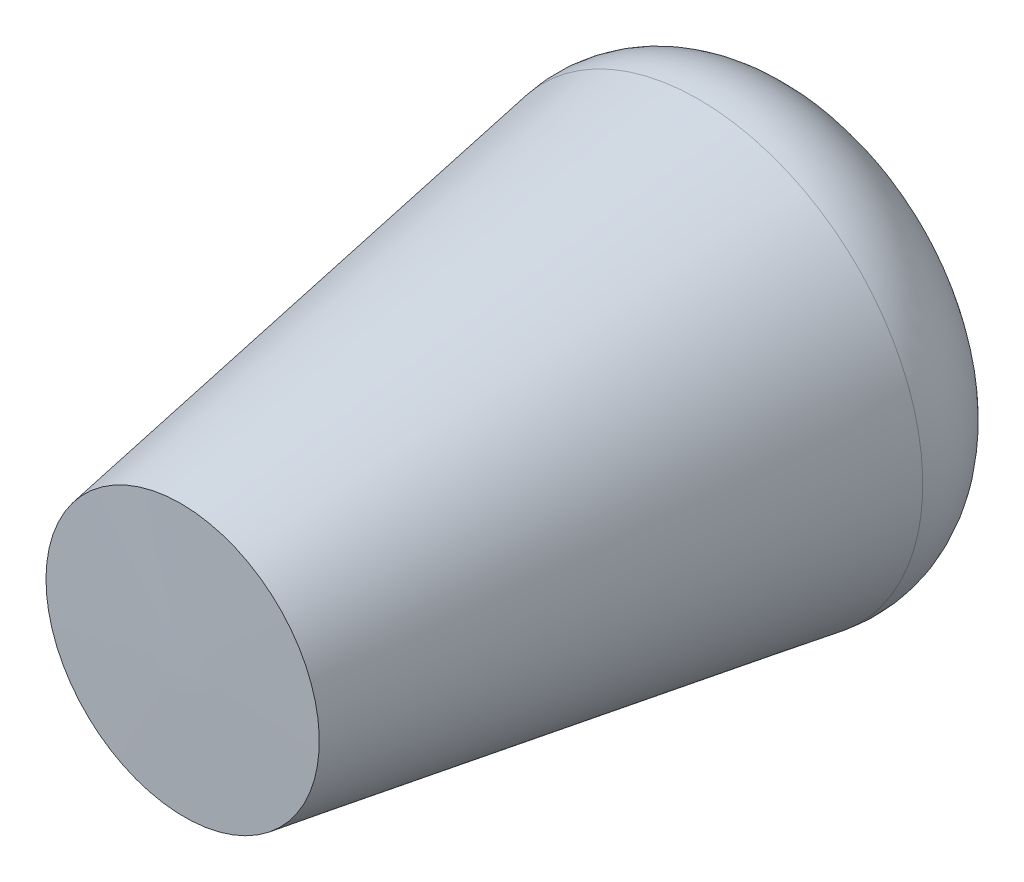
ISO-10303-21;
HEADER;
FILE_DESCRIPTION(('STEP AP214'),'2;1');
FILE_NAME('part.step','',(''),(''),'','','');
FILE_SCHEMA(('AUTOMOTIVE_DESIGN { 1 0 10303 214 1 1 1 1 }'));
ENDSEC;
DATA;
#1=APPLICATION_CONTEXT('core data for automotive mechanical design processes');
#2=APPLICATION_PROTOCOL_DEFINITION('international standard','automotive_design',2000,#1);
#3=PRODUCT_CONTEXT('',#1,'mechanical');
#4=PRODUCT('Part','Part','',(#3));
#5=PRODUCT_RELATED_PRODUCT_CATEGORY('part','',(#4));
#6=PRODUCT_DEFINITION_FORMATION('','',#4);
#7=PRODUCT_DEFINITION_CONTEXT('part definition',#1,'design');
#8=PRODUCT_DEFINITION('design','',#6,#7);
#9=PRODUCT_DEFINITION_SHAPE('','',#8);
#10=(LENGTH_UNIT() NAMED_UNIT(*) SI_UNIT(.MILLI.,.METRE.));
#11=(NAMED_UNIT(*) PLANE_ANGLE_UNIT() SI_UNIT($,.RADIAN.));
#12=(NAMED_UNIT(*) SI_UNIT($,.STERADIAN.) SOLID_ANGLE_UNIT());
#13=UNCERTAINTY_MEASURE_WITH_UNIT(LENGTH_MEASURE(1.E-05),#10,'distance_accuracy_value','');
#14=(GEOMETRIC_REPRESENTATION_CONTEXT(3) GLOBAL_UNCERTAINTY_ASSIGNED_CONTEXT((#13)) GLOBAL_UNIT_ASSIGNED_CONTEXT((#10,
#11,#12)) REPRESENTATION_CONTEXT('',''));
#15=CARTESIAN_POINT('',(0.,0.,0.));
#16=DIRECTION('',(0.,0.,1.));
#17=DIRECTION('',(1.,0.,0.));
#18=AXIS2_PLACEMENT_3D('',#15,#16,#17);
#19=CARTESIAN_POINT('',(0.,0.255970140465668,-19.9983619150967));
#20=DIRECTION('',(0.,0.0127985070232834,-0.999918095754835));
#21=DIRECTION('',(0.,0.999918095754835,0.0127985070232834));
#22=AXIS2_PLACEMENT_3D('',#19,#20,#21);
#23=CONICAL_SURFACE('',#22,0.,1.55799747034281);
#24=CARTESIAN_POINT('',(0.,0.256610270610385,-20.0483738199366));
#25=DIRECTION('',(0.,0.0127985070232834,-0.999918095754835));
#26=DIRECTION('',(0.,0.999918095754835,0.0127985070232834));
#27=AXIS2_PLACEMENT_3D('',#24,#25,#26);
#28=CIRCLE('',#27,3.9076358475948);
#29=CARTESIAN_POINT('',(0.,4.16392606624071,-19.9983619150967));
#30=VERTEX_POINT('',#29);
#31=EDGE_CURVE('E11',#30,#30,#28,.T.);
#32=ORIENTED_EDGE('',*,*,#31,.T.);
#33=EDGE_LOOP('',(#32));
#34=FACE_BOUND('',#33,.T.);
#35=CARTESIAN_POINT('',(0.,0.255970140465668,-19.9983619150967));
#36=VERTEX_POINT('',#35);
#37=VERTEX_LOOP('',#36);
#38=FACE_BOUND('',#37,.T.);
#39=ADVANCED_FACE('F37',(#34,#38),#23,.F.);
#40=CARTESIAN_POINT('',(0.,0.218280854327316,-17.0537841485447));
#41=DIRECTION('',(0.,0.0127985070232834,-0.999918095754835));
#42=DIRECTION('',(0.,0.999918095754835,0.0127985070232834));
#43=AXIS2_PLACEMENT_3D('',#40,#41,#42);
#44=TOROIDAL_SURFACE('',#43,4.08360049131752,3.);
#45=CARTESIAN_POINT('',(0.,0.212098027938829,-16.570734057037));
#46=DIRECTION('',(0.,0.0127985070232834,-0.999918095754835));
#47=DIRECTION('',(0.,0.999918095754835,0.0127985070232834));
#48=AXIS2_PLACEMENT_3D('',#45,#46,#47);
#49=CIRCLE('',#48,7.04444908281157);
#50=CARTESIAN_POINT('',(0.,7.25597014046567,-16.4805756259755));
#51=VERTEX_POINT('',#50);
#52=EDGE_CURVE('E44',#51,#51,#49,.T.);
#53=ORIENTED_EDGE('',*,*,#52,.T.);
#54=EDGE_LOOP('',(#53));
#55=FACE_BOUND('',#54,.T.);
#56=ORIENTED_EDGE('',*,*,#31,.F.);
#57=EDGE_LOOP('',(#56));
#58=FACE_BOUND('',#57,.T.);
#59=ADVANCED_FACE('F51',(#55,#58),#44,.T.);
#60=CARTESIAN_POINT('',(0.,0.212098027938829,-16.570734057037));
#61=DIRECTION('',(0.,0.0127985070232834,-0.999918095754835));
#62=DIRECTION('',(0.,0.999918095754835,0.0127985070232834));
#63=AXIS2_PLACEMENT_3D('',#60,#61,#62);
#64=CONICAL_SURFACE('',#63,7.04444908281157,0.161734068747343);
#65=CARTESIAN_POINT('',(0.,0.000712537751808946,-0.055668945654834));
#66=DIRECTION('',(0.,0.0127985070232834,-0.999918095754835));
#67=DIRECTION('',(0.,0.999918095754835,0.0127985070232834));
#68=AXIS2_PLACEMENT_3D('',#65,#66,#67);
#69=CIRCLE('',#68,4.34964371653353);
#70=CARTESIAN_POINT('',(0.,4.35,0.));
#71=VERTEX_POINT('',#70);
#72=EDGE_CURVE('E74',#71,#71,#69,.T.);
#73=ORIENTED_EDGE('',*,*,#72,.T.);
#74=EDGE_LOOP('',(#73));
#75=FACE_BOUND('',#74,.T.);
#76=ORIENTED_EDGE('',*,*,#52,.F.);
#77=EDGE_LOOP('',(#76));
#78=FACE_BOUND('',#77,.T.);
#79=ADVANCED_FACE('F56',(#75,#78),#64,.T.);
#80=CARTESIAN_POINT('',(0.,0.000712537751808946,-0.055668945654834));
#81=DIRECTION('',(0.,0.0127985070232834,-0.999918095754835));
#82=DIRECTION('',(0.,0.999918095754835,0.0127985070232834));
#83=AXIS2_PLACEMENT_3D('',#80,#81,#82);
#84=CONICAL_SURFACE('',#83,4.34964371653353,1.55799747034281);
#85=CARTESIAN_POINT('',(0.,0.,0.));
#86=VERTEX_POINT('',#85);
#87=VERTEX_LOOP('',#86);
#88=FACE_BOUND('',#87,.T.);
#89=ORIENTED_EDGE('',*,*,#72,.F.);
#90=EDGE_LOOP('',(#89));
#91=FACE_BOUND('',#90,.T.);
#92=ADVANCED_FACE('F63',(#88,#91),#84,.T.);
#93=CLOSED_SHELL('',(#39,#59,#79,#92));
#94=MANIFOLD_SOLID_BREP('B2',#93);
#95=ADVANCED_BREP_SHAPE_REPRESENTATION('',(#18,#94),#14);
#96=SHAPE_DEFINITION_REPRESENTATION(#9,#95);
ENDSEC;
END-ISO-10303-21;
